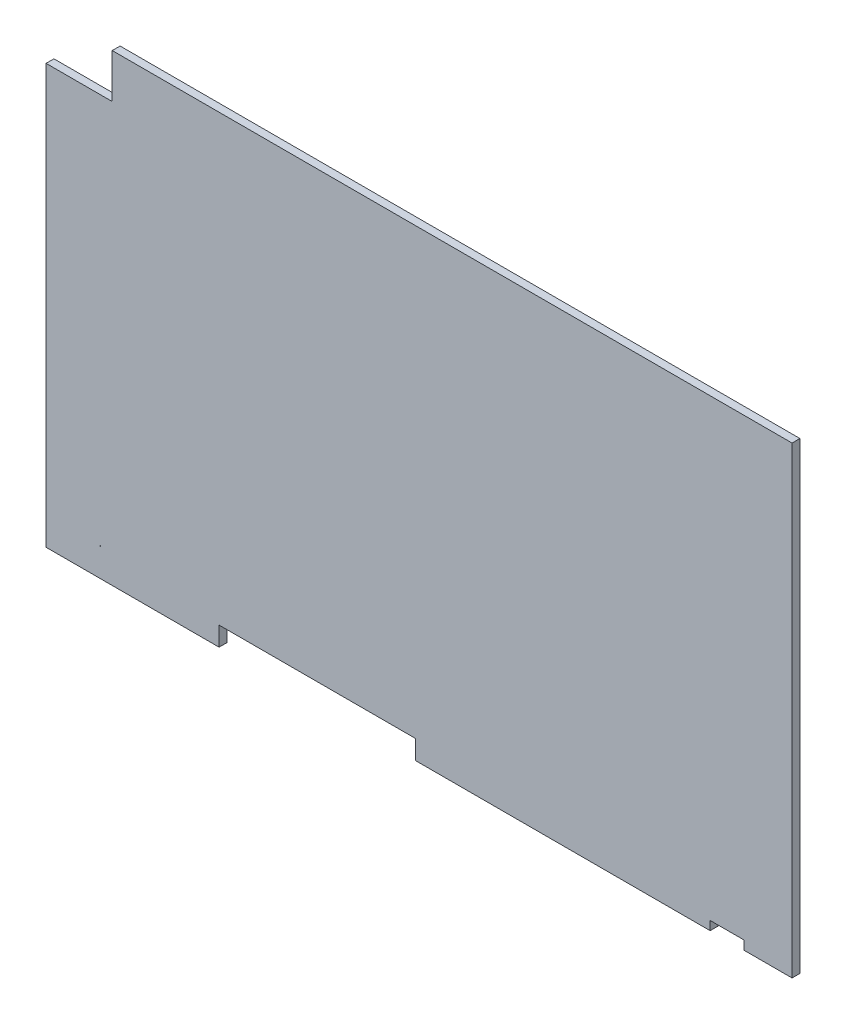
ISO-10303-21;
HEADER;
FILE_DESCRIPTION(('STEP AP214'),'2;1');
FILE_NAME('part.step','',(''),(''),'','','');
FILE_SCHEMA(('AUTOMOTIVE_DESIGN { 1 0 10303 214 1 1 1 1 }'));
ENDSEC;
DATA;
#1=APPLICATION_CONTEXT('core data for automotive mechanical design processes');
#2=APPLICATION_PROTOCOL_DEFINITION('international standard','automotive_design',2000,#1);
#3=PRODUCT_CONTEXT('',#1,'mechanical');
#4=PRODUCT('Part','Part','',(#3));
#5=PRODUCT_RELATED_PRODUCT_CATEGORY('part','',(#4));
#6=PRODUCT_DEFINITION_FORMATION('','',#4);
#7=PRODUCT_DEFINITION_CONTEXT('part definition',#1,'design');
#8=PRODUCT_DEFINITION('design','',#6,#7);
#9=PRODUCT_DEFINITION_SHAPE('','',#8);
#10=(LENGTH_UNIT() NAMED_UNIT(*) SI_UNIT(.MILLI.,.METRE.));
#11=(NAMED_UNIT(*) PLANE_ANGLE_UNIT() SI_UNIT($,.RADIAN.));
#12=(NAMED_UNIT(*) SI_UNIT($,.STERADIAN.) SOLID_ANGLE_UNIT());
#13=UNCERTAINTY_MEASURE_WITH_UNIT(LENGTH_MEASURE(1.E-05),#10,'distance_accuracy_value','');
#14=(GEOMETRIC_REPRESENTATION_CONTEXT(3) GLOBAL_UNCERTAINTY_ASSIGNED_CONTEXT((#13)) GLOBAL_UNIT_ASSIGNED_CONTEXT((#10,
#11,#12)) REPRESENTATION_CONTEXT('',''));
#15=CARTESIAN_POINT('',(0.,0.,0.));
#16=DIRECTION('',(0.,0.,1.));
#17=DIRECTION('',(1.,0.,0.));
#18=AXIS2_PLACEMENT_3D('',#15,#16,#17);
#19=CARTESIAN_POINT('',(-288.3708683859,210.3723583045,-1.7600024));
#20=DIRECTION('',(0.,0.,1.));
#21=DIRECTION('',(1.,0.,0.));
#22=AXIS2_PLACEMENT_3D('',#19,#20,#21);
#23=CYLINDRICAL_SURFACE('',#22,0.06249923999972);
#24=CARTESIAN_POINT('',(-288.3708683859,210.3723583045,0.));
#25=DIRECTION('',(0.,0.,-1.));
#26=DIRECTION('',(-1.,0.,0.));
#27=AXIS2_PLACEMENT_3D('',#24,#25,#26);
#28=CIRCLE('',#27,0.06249923999972);
#29=CARTESIAN_POINT('',(-288.4333676259,210.3723583045,0.));
#30=VERTEX_POINT('',#29);
#31=CARTESIAN_POINT('',(-288.3083691459,210.3723583045,0.));
#32=VERTEX_POINT('',#31);
#33=EDGE_CURVE('E249',#30,#32,#28,.T.);
#34=ORIENTED_EDGE('',*,*,#33,.F.);
#35=DIRECTION('',(0.,0.,-1.));
#36=VECTOR('',#35,1.);
#37=CARTESIAN_POINT('',(-288.4333676259,210.3723583045,0.));
#38=LINE('',#37,#36);
#39=CARTESIAN_POINT('',(-288.4333676259,210.3723583045,-1.6));
#40=VERTEX_POINT('',#39);
#41=EDGE_CURVE('E11',#30,#40,#38,.T.);
#42=ORIENTED_EDGE('',*,*,#41,.T.);
#43=CARTESIAN_POINT('',(-288.3708683859,210.3723583045,-1.6));
#44=DIRECTION('',(0.,0.,1.));
#45=DIRECTION('',(1.,0.,0.));
#46=AXIS2_PLACEMENT_3D('',#43,#44,#45);
#47=CIRCLE('',#46,0.06249923999972);
#48=CARTESIAN_POINT('',(-288.3083691459,210.3723583045,-1.6));
#49=VERTEX_POINT('',#48);
#50=EDGE_CURVE('E177',#49,#40,#47,.T.);
#51=ORIENTED_EDGE('',*,*,#50,.F.);
#52=DIRECTION('',(0.,0.,-1.));
#53=VECTOR('',#52,1.);
#54=CARTESIAN_POINT('',(-288.3083691459,210.3723583045,0.));
#55=LINE('',#54,#53);
#56=EDGE_CURVE('E26',#32,#49,#55,.T.);
#57=ORIENTED_EDGE('',*,*,#56,.F.);
#58=EDGE_LOOP('',(#34,#42,#51,#57));
#59=FACE_BOUND('',#58,.T.);
#60=ADVANCED_FACE('F17',(#59),#23,.F.);
#61=CARTESIAN_POINT('',(-288.3708683859,210.3723583045,-1.7600024));
#62=DIRECTION('',(0.,0.,1.));
#63=DIRECTION('',(1.,0.,0.));
#64=AXIS2_PLACEMENT_3D('',#61,#62,#63);
#65=CYLINDRICAL_SURFACE('',#64,0.06249923999972);
#66=ORIENTED_EDGE('',*,*,#56,.T.);
#67=CARTESIAN_POINT('',(-288.3708683859,210.3723583045,-1.6));
#68=DIRECTION('',(0.,0.,1.));
#69=DIRECTION('',(-1.,0.,0.));
#70=AXIS2_PLACEMENT_3D('',#67,#68,#69);
#71=CIRCLE('',#70,0.06249923999972);
#72=EDGE_CURVE('E181',#40,#49,#71,.T.);
#73=ORIENTED_EDGE('',*,*,#72,.F.);
#74=ORIENTED_EDGE('',*,*,#41,.F.);
#75=CARTESIAN_POINT('',(-288.3708683859,210.3723583045,0.));
#76=DIRECTION('',(0.,0.,-1.));
#77=DIRECTION('',(1.,0.,0.));
#78=AXIS2_PLACEMENT_3D('',#75,#76,#77);
#79=CIRCLE('',#78,0.06249923999972);
#80=EDGE_CURVE('E244',#32,#30,#79,.T.);
#81=ORIENTED_EDGE('',*,*,#80,.F.);
#82=EDGE_LOOP('',(#66,#73,#74,#81));
#83=FACE_BOUND('',#82,.T.);
#84=ADVANCED_FACE('F19',(#83),#65,.F.);
#85=CARTESIAN_POINT('',(-285.933831,208.874579,21.27488936264));
#86=DIRECTION('',(-1.,0.,0.));
#87=DIRECTION('',(0.,0.,1.));
#88=AXIS2_PLACEMENT_3D('',#85,#86,#87);
#89=PLANE('',#88);
#90=DIRECTION('',(0.,0.,1.));
#91=VECTOR('',#90,1.);
#92=CARTESIAN_POINT('',(-285.933831,290.0245785123,-1.6));
#93=LINE('',#92,#91);
#94=CARTESIAN_POINT('',(-285.933831,290.0245785123,-1.6));
#95=VERTEX_POINT('',#94);
#96=CARTESIAN_POINT('',(-285.933831,290.0245785123,0.));
#97=VERTEX_POINT('',#96);
#98=EDGE_CURVE('E261',#95,#97,#93,.T.);
#99=ORIENTED_EDGE('',*,*,#98,.T.);
#100=DIRECTION('',(0.,1.,0.));
#101=VECTOR('',#100,1.);
#102=CARTESIAN_POINT('',(-285.933831,290.0245785123,0.));
#103=LINE('',#102,#101);
#104=CARTESIAN_POINT('',(-285.933831,299.0245785123,0.));
#105=VERTEX_POINT('',#104);
#106=EDGE_CURVE('E221',#97,#105,#103,.T.);
#107=ORIENTED_EDGE('',*,*,#106,.T.);
#108=DIRECTION('',(0.,0.,-1.));
#109=VECTOR('',#108,1.);
#110=CARTESIAN_POINT('',(-285.933831,299.0245785123,0.));
#111=LINE('',#110,#109);
#112=CARTESIAN_POINT('',(-285.933831,299.0245785123,-1.6));
#113=VERTEX_POINT('',#112);
#114=EDGE_CURVE('E206',#105,#113,#111,.T.);
#115=ORIENTED_EDGE('',*,*,#114,.T.);
#116=DIRECTION('',(0.,1.,0.));
#117=VECTOR('',#116,1.);
#118=CARTESIAN_POINT('',(-285.933831,290.0245785123,-1.6));
#119=LINE('',#118,#117);
#120=EDGE_CURVE('E267',#95,#113,#119,.T.);
#121=ORIENTED_EDGE('',*,*,#120,.F.);
#122=EDGE_LOOP('',(#99,#107,#115,#121));
#123=FACE_BOUND('',#122,.T.);
#124=ADVANCED_FACE('F356',(#123),#89,.T.);
#125=CARTESIAN_POINT('',(-177.1665265142,299.0245785123,0.));
#126=DIRECTION('',(0.,1.,0.));
#127=DIRECTION('',(1.,0.,0.));
#128=AXIS2_PLACEMENT_3D('',#125,#126,#127);
#129=PLANE('',#128);
#130=DIRECTION('',(1.,0.,0.));
#131=VECTOR('',#130,1.);
#132=CARTESIAN_POINT('',(-285.933831,299.0245785123,0.));
#133=LINE('',#132,#131);
#134=CARTESIAN_POINT('',(-147.4165265142,299.0245785123,0.));
#135=VERTEX_POINT('',#134);
#136=EDGE_CURVE('E313',#105,#135,#133,.T.);
#137=ORIENTED_EDGE('',*,*,#136,.T.);
#138=DIRECTION('',(0.,0.,1.));
#139=VECTOR('',#138,1.);
#140=CARTESIAN_POINT('',(-147.4165265142,299.0245785123,-1.6));
#141=LINE('',#140,#139);
#142=CARTESIAN_POINT('',(-147.4165265142,299.0245785123,-1.6));
#143=VERTEX_POINT('',#142);
#144=EDGE_CURVE('E204',#143,#135,#141,.T.);
#145=ORIENTED_EDGE('',*,*,#144,.F.);
#146=DIRECTION('',(1.,0.,0.));
#147=VECTOR('',#146,1.);
#148=CARTESIAN_POINT('',(-285.933831,299.0245785123,-1.6));
#149=LINE('',#148,#147);
#150=EDGE_CURVE('E270',#113,#143,#149,.T.);
#151=ORIENTED_EDGE('',*,*,#150,.F.);
#152=ORIENTED_EDGE('',*,*,#114,.F.);
#153=EDGE_LOOP('',(#137,#145,#151,#152));
#154=FACE_BOUND('',#153,.T.);
#155=ADVANCED_FACE('F609',(#154),#129,.T.);
#156=CARTESIAN_POINT('',(-147.4165265142,204.6245785127,0.));
#157=DIRECTION('',(1.,0.,0.));
#158=DIRECTION('',(0.,1.,0.));
#159=AXIS2_PLACEMENT_3D('',#156,#157,#158);
#160=PLANE('',#159);
#161=DIRECTION('',(0.,0.,-1.));
#162=VECTOR('',#161,1.);
#163=CARTESIAN_POINT('',(-147.4165265142,204.6245785127,0.));
#164=LINE('',#163,#162);
#165=CARTESIAN_POINT('',(-147.4165265142,204.6245785127,0.));
#166=VERTEX_POINT('',#165);
#167=CARTESIAN_POINT('',(-147.4165265142,204.6245785127,-1.6));
#168=VERTEX_POINT('',#167);
#169=EDGE_CURVE('E201',#166,#168,#164,.T.);
#170=ORIENTED_EDGE('',*,*,#169,.T.);
#171=DIRECTION('',(0.,-1.,0.));
#172=VECTOR('',#171,1.);
#173=CARTESIAN_POINT('',(-147.4165265142,299.0245785123,-1.6));
#174=LINE('',#173,#172);
#175=EDGE_CURVE('E274',#143,#168,#174,.T.);
#176=ORIENTED_EDGE('',*,*,#175,.F.);
#177=ORIENTED_EDGE('',*,*,#144,.T.);
#178=DIRECTION('',(0.,-1.,0.));
#179=VECTOR('',#178,1.);
#180=CARTESIAN_POINT('',(-147.4165265142,299.0245785123,0.));
#181=LINE('',#180,#179);
#182=EDGE_CURVE('E240',#135,#166,#181,.T.);
#183=ORIENTED_EDGE('',*,*,#182,.T.);
#184=EDGE_LOOP('',(#170,#176,#177,#183));
#185=FACE_BOUND('',#184,.T.);
#186=ADVANCED_FACE('F597',(#185),#160,.T.);
#187=CARTESIAN_POINT('',(-320.4165265137,204.6245785127,0.));
#188=DIRECTION('',(0.,-1.,0.));
#189=DIRECTION('',(0.,0.,-1.));
#190=AXIS2_PLACEMENT_3D('',#187,#188,#189);
#191=PLANE('',#190);
#192=ORIENTED_EDGE('',*,*,#169,.F.);
#193=DIRECTION('',(-1.,0.,0.));
#194=VECTOR('',#193,1.);
#195=CARTESIAN_POINT('',(-147.4165265142,204.6245785127,0.));
#196=LINE('',#195,#194);
#197=CARTESIAN_POINT('',(-157.2215265136,204.6245785127,0.));
#198=VERTEX_POINT('',#197);
#199=EDGE_CURVE('E226',#166,#198,#196,.T.);
#200=ORIENTED_EDGE('',*,*,#199,.T.);
#201=DIRECTION('',(0.,0.,-1.));
#202=VECTOR('',#201,1.);
#203=CARTESIAN_POINT('',(-157.2215265136,204.6245785127,0.));
#204=LINE('',#203,#202);
#205=CARTESIAN_POINT('',(-157.2215265136,204.6245785127,-1.6));
#206=VERTEX_POINT('',#205);
#207=EDGE_CURVE('E198',#198,#206,#204,.T.);
#208=ORIENTED_EDGE('',*,*,#207,.T.);
#209=DIRECTION('',(-1.,0.,0.));
#210=VECTOR('',#209,1.);
#211=CARTESIAN_POINT('',(-147.4165265142,204.6245785127,-1.6));
#212=LINE('',#211,#210);
#213=EDGE_CURVE('E278',#168,#206,#212,.T.);
#214=ORIENTED_EDGE('',*,*,#213,.F.);
#215=EDGE_LOOP('',(#192,#200,#208,#214));
#216=FACE_BOUND('',#215,.T.);
#217=ADVANCED_FACE('F600',(#216),#191,.T.);
#218=CARTESIAN_POINT('',(-157.2215265136,205.9345785127,-1.7600024));
#219=DIRECTION('',(1.,0.,0.));
#220=DIRECTION('',(0.,1.,0.));
#221=AXIS2_PLACEMENT_3D('',#218,#219,#220);
#222=PLANE('',#221);
#223=DIRECTION('',(0.,-1.,0.));
#224=VECTOR('',#223,1.);
#225=CARTESIAN_POINT('',(-157.2215265136,206.4345785127,0.));
#226=LINE('',#225,#224);
#227=CARTESIAN_POINT('',(-157.2215265136,206.4345785127,0.));
#228=VERTEX_POINT('',#227);
#229=EDGE_CURVE('E223',#228,#198,#226,.T.);
#230=ORIENTED_EDGE('',*,*,#229,.F.);
#231=DIRECTION('',(0.,0.,-1.));
#232=VECTOR('',#231,1.);
#233=CARTESIAN_POINT('',(-157.2215265136,206.4345785127,0.));
#234=LINE('',#233,#232);
#235=CARTESIAN_POINT('',(-157.2215265136,206.4345785127,-1.6));
#236=VERTEX_POINT('',#235);
#237=EDGE_CURVE('E195',#228,#236,#234,.T.);
#238=ORIENTED_EDGE('',*,*,#237,.T.);
#239=DIRECTION('',(0.,-1.,0.));
#240=VECTOR('',#239,1.);
#241=CARTESIAN_POINT('',(-157.2215265136,206.4345785127,-1.6));
#242=LINE('',#241,#240);
#243=EDGE_CURVE('E282',#236,#206,#242,.T.);
#244=ORIENTED_EDGE('',*,*,#243,.T.);
#245=ORIENTED_EDGE('',*,*,#207,.F.);
#246=EDGE_LOOP('',(#230,#238,#244,#245));
#247=FACE_BOUND('',#246,.T.);
#248=ADVANCED_FACE('F296',(#247),#222,.F.);
#249=CARTESIAN_POINT('',(-164.1115265136,206.4345785127,-1.7600024));
#250=DIRECTION('',(0.,1.,0.));
#251=DIRECTION('',(1.,0.,0.));
#252=AXIS2_PLACEMENT_3D('',#249,#250,#251);
#253=PLANE('',#252);
#254=DIRECTION('',(0.,0.,1.));
#255=VECTOR('',#254,1.);
#256=CARTESIAN_POINT('',(-164.1115265136,206.4345785127,-1.6));
#257=LINE('',#256,#255);
#258=CARTESIAN_POINT('',(-164.1115265136,206.4345785127,-1.6));
#259=VERTEX_POINT('',#258);
#260=CARTESIAN_POINT('',(-164.1115265136,206.4345785127,0.));
#261=VERTEX_POINT('',#260);
#262=EDGE_CURVE('E192',#259,#261,#257,.T.);
#263=ORIENTED_EDGE('',*,*,#262,.F.);
#264=DIRECTION('',(1.,0.,0.));
#265=VECTOR('',#264,1.);
#266=CARTESIAN_POINT('',(-164.1115265136,206.4345785127,-1.6));
#267=LINE('',#266,#265);
#268=EDGE_CURVE('E164',#259,#236,#267,.T.);
#269=ORIENTED_EDGE('',*,*,#268,.T.);
#270=ORIENTED_EDGE('',*,*,#237,.F.);
#271=DIRECTION('',(1.,0.,0.));
#272=VECTOR('',#271,1.);
#273=CARTESIAN_POINT('',(-164.1115265136,206.4345785127,0.));
#274=LINE('',#273,#272);
#275=EDGE_CURVE('E227',#261,#228,#274,.T.);
#276=ORIENTED_EDGE('',*,*,#275,.F.);
#277=EDGE_LOOP('',(#263,#269,#270,#276));
#278=FACE_BOUND('',#277,.T.);
#279=ADVANCED_FACE('F291',(#278),#253,.F.);
#280=CARTESIAN_POINT('',(-164.1115265136,200.57397023,-1.7600024));
#281=DIRECTION('',(-1.,0.,0.));
#282=DIRECTION('',(0.,0.,1.));
#283=AXIS2_PLACEMENT_3D('',#280,#281,#282);
#284=PLANE('',#283);
#285=DIRECTION('',(0.,0.,1.));
#286=VECTOR('',#285,1.);
#287=CARTESIAN_POINT('',(-164.1115265136,204.6245785127,-1.6));
#288=LINE('',#287,#286);
#289=CARTESIAN_POINT('',(-164.1115265136,204.6245785127,-1.6));
#290=VERTEX_POINT('',#289);
#291=CARTESIAN_POINT('',(-164.1115265136,204.6245785127,0.));
#292=VERTEX_POINT('',#291);
#293=EDGE_CURVE('E141',#290,#292,#288,.T.);
#294=ORIENTED_EDGE('',*,*,#293,.F.);
#295=DIRECTION('',(0.,1.,0.));
#296=VECTOR('',#295,1.);
#297=CARTESIAN_POINT('',(-164.1115265136,204.6245785127,-1.6));
#298=LINE('',#297,#296);
#299=EDGE_CURVE('E157',#290,#259,#298,.T.);
#300=ORIENTED_EDGE('',*,*,#299,.T.);
#301=ORIENTED_EDGE('',*,*,#262,.T.);
#302=DIRECTION('',(0.,1.,0.));
#303=VECTOR('',#302,1.);
#304=CARTESIAN_POINT('',(-164.1115265136,204.6245785127,0.));
#305=LINE('',#304,#303);
#306=EDGE_CURVE('E243',#292,#261,#305,.T.);
#307=ORIENTED_EDGE('',*,*,#306,.F.);
#308=EDGE_LOOP('',(#294,#300,#301,#307));
#309=FACE_BOUND('',#308,.T.);
#310=ADVANCED_FACE('F634',(#309),#284,.F.);
#311=CARTESIAN_POINT('',(-320.4165265137,204.6245785127,0.));
#312=DIRECTION('',(0.,-1.,0.));
#313=DIRECTION('',(0.,0.,-1.));
#314=AXIS2_PLACEMENT_3D('',#311,#312,#313);
#315=PLANE('',#314);
#316=DIRECTION('',(-1.,0.,0.));
#317=VECTOR('',#316,1.);
#318=CARTESIAN_POINT('',(-164.1115265136,204.6245785127,0.));
#319=LINE('',#318,#317);
#320=CARTESIAN_POINT('',(-224.1665256919,204.6245785127,0.));
#321=VERTEX_POINT('',#320);
#322=EDGE_CURVE('E136',#292,#321,#319,.T.);
#323=ORIENTED_EDGE('',*,*,#322,.T.);
#324=DIRECTION('',(0.,0.,-1.));
#325=VECTOR('',#324,1.);
#326=CARTESIAN_POINT('',(-224.1665256919,204.6245785127,0.));
#327=LINE('',#326,#325);
#328=CARTESIAN_POINT('',(-224.1665256919,204.6245785127,-1.6));
#329=VERTEX_POINT('',#328);
#330=EDGE_CURVE('E129',#321,#329,#327,.T.);
#331=ORIENTED_EDGE('',*,*,#330,.T.);
#332=DIRECTION('',(-1.,0.,0.));
#333=VECTOR('',#332,1.);
#334=CARTESIAN_POINT('',(-164.1115265136,204.6245785127,-1.6));
#335=LINE('',#334,#333);
#336=EDGE_CURVE('E133',#290,#329,#335,.T.);
#337=ORIENTED_EDGE('',*,*,#336,.F.);
#338=ORIENTED_EDGE('',*,*,#293,.T.);
#339=EDGE_LOOP('',(#323,#331,#337,#338));
#340=FACE_BOUND('',#339,.T.);
#341=ADVANCED_FACE('F131',(#340),#315,.T.);
#342=CARTESIAN_POINT('',(-224.1665256919,208.7745785446,-1.7600024));
#343=DIRECTION('',(1.,0.,0.));
#344=DIRECTION('',(0.,1.,0.));
#345=AXIS2_PLACEMENT_3D('',#342,#343,#344);
#346=PLANE('',#345);
#347=DIRECTION('',(0.,-1.,0.));
#348=VECTOR('',#347,1.);
#349=CARTESIAN_POINT('',(-224.1665256919,208.5245785446,0.));
#350=LINE('',#349,#348);
#351=CARTESIAN_POINT('',(-224.1665256919,208.5245785446,0.));
#352=VERTEX_POINT('',#351);
#353=EDGE_CURVE('E228',#352,#321,#350,.T.);
#354=ORIENTED_EDGE('',*,*,#353,.F.);
#355=DIRECTION('',(0.,0.,-1.));
#356=VECTOR('',#355,1.);
#357=CARTESIAN_POINT('',(-224.1665256919,208.5245785446,0.));
#358=LINE('',#357,#356);
#359=CARTESIAN_POINT('',(-224.1665256919,208.5245785446,-1.6));
#360=VERTEX_POINT('',#359);
#361=EDGE_CURVE('E142',#352,#360,#358,.T.);
#362=ORIENTED_EDGE('',*,*,#361,.T.);
#363=DIRECTION('',(0.,-1.,0.));
#364=VECTOR('',#363,1.);
#365=CARTESIAN_POINT('',(-224.1665256919,208.5245785446,-1.6));
#366=LINE('',#365,#364);
#367=EDGE_CURVE('E145',#360,#329,#366,.T.);
#368=ORIENTED_EDGE('',*,*,#367,.T.);
#369=ORIENTED_EDGE('',*,*,#330,.F.);
#370=EDGE_LOOP('',(#354,#362,#368,#369));
#371=FACE_BOUND('',#370,.T.);
#372=ADVANCED_FACE('F146',(#371),#346,.F.);
#373=CARTESIAN_POINT('',(-260.5915257238,208.5245785446,-1.7600024));
#374=DIRECTION('',(0.,1.,0.));
#375=DIRECTION('',(1.,0.,0.));
#376=AXIS2_PLACEMENT_3D('',#373,#374,#375);
#377=PLANE('',#376);
#378=DIRECTION('',(0.,0.,1.));
#379=VECTOR('',#378,1.);
#380=CARTESIAN_POINT('',(-264.1665257238,208.5245785446,-1.6));
#381=LINE('',#380,#379);
#382=CARTESIAN_POINT('',(-264.1665257238,208.5245785446,-1.6));
#383=VERTEX_POINT('',#382);
#384=CARTESIAN_POINT('',(-264.1665257238,208.5245785446,0.));
#385=VERTEX_POINT('',#384);
#386=EDGE_CURVE('E187',#383,#385,#381,.T.);
#387=ORIENTED_EDGE('',*,*,#386,.F.);
#388=DIRECTION('',(1.,0.,0.));
#389=VECTOR('',#388,1.);
#390=CARTESIAN_POINT('',(-264.1665257238,208.5245785446,-1.6));
#391=LINE('',#390,#389);
#392=EDGE_CURVE('E151',#383,#360,#391,.T.);
#393=ORIENTED_EDGE('',*,*,#392,.T.);
#394=ORIENTED_EDGE('',*,*,#361,.F.);
#395=DIRECTION('',(1.,0.,0.));
#396=VECTOR('',#395,1.);
#397=CARTESIAN_POINT('',(-264.1665257238,208.5245785446,0.));
#398=LINE('',#397,#396);
#399=EDGE_CURVE('E231',#385,#352,#398,.T.);
#400=ORIENTED_EDGE('',*,*,#399,.F.);
#401=EDGE_LOOP('',(#387,#393,#394,#400));
#402=FACE_BOUND('',#401,.T.);
#403=ADVANCED_FACE('F341',(#402),#377,.F.);
#404=CARTESIAN_POINT('',(-264.1665257238,199.3393347496,-1.7600024));
#405=DIRECTION('',(-1.,0.,0.));
#406=DIRECTION('',(0.,0.,1.));
#407=AXIS2_PLACEMENT_3D('',#404,#405,#406);
#408=PLANE('',#407);
#409=DIRECTION('',(0.,1.,0.));
#410=VECTOR('',#409,1.);
#411=CARTESIAN_POINT('',(-264.1665257238,204.6245785127,-1.6));
#412=LINE('',#411,#410);
#413=CARTESIAN_POINT('',(-264.1665257238,204.6245785127,-1.6));
#414=VERTEX_POINT('',#413);
#415=EDGE_CURVE('E170',#414,#383,#412,.T.);
#416=ORIENTED_EDGE('',*,*,#415,.T.);
#417=ORIENTED_EDGE('',*,*,#386,.T.);
#418=DIRECTION('',(0.,1.,0.));
#419=VECTOR('',#418,1.);
#420=CARTESIAN_POINT('',(-264.1665257238,204.6245785127,0.));
#421=LINE('',#420,#419);
#422=CARTESIAN_POINT('',(-264.1665257238,204.6245785127,0.));
#423=VERTEX_POINT('',#422);
#424=EDGE_CURVE('E316',#423,#385,#421,.T.);
#425=ORIENTED_EDGE('',*,*,#424,.F.);
#426=DIRECTION('',(0.,0.,1.));
#427=VECTOR('',#426,1.);
#428=CARTESIAN_POINT('',(-264.1665257238,204.6245785127,-1.6));
#429=LINE('',#428,#427);
#430=EDGE_CURVE('E184',#414,#423,#429,.T.);
#431=ORIENTED_EDGE('',*,*,#430,.F.);
#432=EDGE_LOOP('',(#416,#417,#425,#431));
#433=FACE_BOUND('',#432,.T.);
#434=ADVANCED_FACE('F338',(#433),#408,.F.);
#435=CARTESIAN_POINT('',(-290.4165265137,204.6245785127,0.));
#436=DIRECTION('',(0.,-1.,0.));
#437=DIRECTION('',(0.,0.,-1.));
#438=AXIS2_PLACEMENT_3D('',#435,#436,#437);
#439=PLANE('',#438);
#440=DIRECTION('',(-1.,0.,0.));
#441=VECTOR('',#440,1.);
#442=CARTESIAN_POINT('',(-264.1665257238,204.6245785127,0.));
#443=LINE('',#442,#441);
#444=CARTESIAN_POINT('',(-299.4165265136,204.6245785127,0.));
#445=VERTEX_POINT('',#444);
#446=EDGE_CURVE('E322',#423,#445,#443,.T.);
#447=ORIENTED_EDGE('',*,*,#446,.T.);
#448=DIRECTION('',(0.,0.,-1.));
#449=VECTOR('',#448,1.);
#450=CARTESIAN_POINT('',(-299.4165265136,204.6245785127,0.));
#451=LINE('',#450,#449);
#452=CARTESIAN_POINT('',(-299.4165265136,204.6245785127,-1.6));
#453=VERTEX_POINT('',#452);
#454=EDGE_CURVE('E253',#445,#453,#451,.T.);
#455=ORIENTED_EDGE('',*,*,#454,.T.);
#456=DIRECTION('',(-1.,0.,0.));
#457=VECTOR('',#456,1.);
#458=CARTESIAN_POINT('',(-264.1665257238,204.6245785127,-1.6));
#459=LINE('',#458,#457);
#460=EDGE_CURVE('E174',#414,#453,#459,.T.);
#461=ORIENTED_EDGE('',*,*,#460,.F.);
#462=ORIENTED_EDGE('',*,*,#430,.T.);
#463=EDGE_LOOP('',(#447,#455,#461,#462));
#464=FACE_BOUND('',#463,.T.);
#465=ADVANCED_FACE('F346',(#464),#439,.T.);
#466=CARTESIAN_POINT('',(0.,0.,-1.6));
#467=DIRECTION('',(0.,0.,1.));
#468=DIRECTION('',(1.,0.,0.));
#469=AXIS2_PLACEMENT_3D('',#466,#467,#468);
#470=PLANE('',#469);
#471=ORIENTED_EDGE('',*,*,#50,.T.);
#472=ORIENTED_EDGE('',*,*,#72,.T.);
#473=EDGE_LOOP('',(#471,#472));
#474=FACE_BOUND('',#473,.T.);
#475=ORIENTED_EDGE('',*,*,#120,.T.);
#476=ORIENTED_EDGE('',*,*,#150,.T.);
#477=ORIENTED_EDGE('',*,*,#175,.T.);
#478=ORIENTED_EDGE('',*,*,#213,.T.);
#479=ORIENTED_EDGE('',*,*,#243,.F.);
#480=ORIENTED_EDGE('',*,*,#268,.F.);
#481=ORIENTED_EDGE('',*,*,#299,.F.);
#482=ORIENTED_EDGE('',*,*,#336,.T.);
#483=ORIENTED_EDGE('',*,*,#367,.F.);
#484=ORIENTED_EDGE('',*,*,#392,.F.);
#485=ORIENTED_EDGE('',*,*,#415,.F.);
#486=ORIENTED_EDGE('',*,*,#460,.T.);
#487=DIRECTION('',(0.,1.,0.));
#488=VECTOR('',#487,1.);
#489=CARTESIAN_POINT('',(-299.4165265136,204.6245785127,-1.6));
#490=LINE('',#489,#488);
#491=CARTESIAN_POINT('',(-299.4165265136,290.0245785123,-1.6));
#492=VERTEX_POINT('',#491);
#493=EDGE_CURVE('E248',#453,#492,#490,.T.);
#494=ORIENTED_EDGE('',*,*,#493,.T.);
#495=DIRECTION('',(-1.,0.,0.));
#496=VECTOR('',#495,1.);
#497=CARTESIAN_POINT('',(-285.933831,290.0245785123,-1.6));
#498=LINE('',#497,#496);
#499=EDGE_CURVE('E264',#95,#492,#498,.T.);
#500=ORIENTED_EDGE('',*,*,#499,.F.);
#501=EDGE_LOOP('',(#475,#476,#477,#478,#479,#480,#481,#482,#483,#484,#485,#486,#494,#500));
#502=FACE_BOUND('',#501,.T.);
#503=ADVANCED_FACE('F154',(#474,#502),#470,.F.);
#504=CARTESIAN_POINT('',(-291.4165265136,290.0245785123,-1.7600024));
#505=DIRECTION('',(0.,-1.,0.));
#506=DIRECTION('',(0.,0.,-1.));
#507=AXIS2_PLACEMENT_3D('',#504,#505,#506);
#508=PLANE('',#507);
#509=DIRECTION('',(-1.,0.,0.));
#510=VECTOR('',#509,1.);
#511=CARTESIAN_POINT('',(-285.933831,290.0245785123,0.));
#512=LINE('',#511,#510);
#513=CARTESIAN_POINT('',(-299.4165265136,290.0245785123,0.));
#514=VERTEX_POINT('',#513);
#515=EDGE_CURVE('E232',#97,#514,#512,.T.);
#516=ORIENTED_EDGE('',*,*,#515,.F.);
#517=ORIENTED_EDGE('',*,*,#98,.F.);
#518=ORIENTED_EDGE('',*,*,#499,.T.);
#519=DIRECTION('',(0.,0.,-1.));
#520=VECTOR('',#519,1.);
#521=CARTESIAN_POINT('',(-299.4165265136,290.0245785123,0.));
#522=LINE('',#521,#520);
#523=EDGE_CURVE('E257',#514,#492,#522,.T.);
#524=ORIENTED_EDGE('',*,*,#523,.F.);
#525=EDGE_LOOP('',(#516,#517,#518,#524));
#526=FACE_BOUND('',#525,.T.);
#527=ADVANCED_FACE('F353',(#526),#508,.F.);
#528=CARTESIAN_POINT('',(-299.4165265136,299.3745785123,0.));
#529=DIRECTION('',(-1.,0.,0.));
#530=DIRECTION('',(0.,0.,1.));
#531=AXIS2_PLACEMENT_3D('',#528,#529,#530);
#532=PLANE('',#531);
#533=ORIENTED_EDGE('',*,*,#493,.F.);
#534=ORIENTED_EDGE('',*,*,#454,.F.);
#535=DIRECTION('',(0.,1.,0.));
#536=VECTOR('',#535,1.);
#537=CARTESIAN_POINT('',(-299.4165265136,204.6245785127,0.));
#538=LINE('',#537,#536);
#539=EDGE_CURVE('E236',#445,#514,#538,.T.);
#540=ORIENTED_EDGE('',*,*,#539,.T.);
#541=ORIENTED_EDGE('',*,*,#523,.T.);
#542=EDGE_LOOP('',(#533,#534,#540,#541));
#543=FACE_BOUND('',#542,.T.);
#544=ADVANCED_FACE('F350',(#543),#532,.T.);
#545=CARTESIAN_POINT('',(0.,0.,0.));
#546=DIRECTION('',(0.,0.,1.));
#547=DIRECTION('',(1.,0.,0.));
#548=AXIS2_PLACEMENT_3D('',#545,#546,#547);
#549=PLANE('',#548);
#550=ORIENTED_EDGE('',*,*,#33,.T.);
#551=ORIENTED_EDGE('',*,*,#80,.T.);
#552=EDGE_LOOP('',(#550,#551));
#553=FACE_BOUND('',#552,.T.);
#554=ORIENTED_EDGE('',*,*,#446,.F.);
#555=ORIENTED_EDGE('',*,*,#424,.T.);
#556=ORIENTED_EDGE('',*,*,#399,.T.);
#557=ORIENTED_EDGE('',*,*,#353,.T.);
#558=ORIENTED_EDGE('',*,*,#322,.F.);
#559=ORIENTED_EDGE('',*,*,#306,.T.);
#560=ORIENTED_EDGE('',*,*,#275,.T.);
#561=ORIENTED_EDGE('',*,*,#229,.T.);
#562=ORIENTED_EDGE('',*,*,#199,.F.);
#563=ORIENTED_EDGE('',*,*,#182,.F.);
#564=ORIENTED_EDGE('',*,*,#136,.F.);
#565=ORIENTED_EDGE('',*,*,#106,.F.);
#566=ORIENTED_EDGE('',*,*,#515,.T.);
#567=ORIENTED_EDGE('',*,*,#539,.F.);
#568=EDGE_LOOP('',(#554,#555,#556,#557,#558,#559,#560,#561,#562,#563,#564,#565,#566,#567));
#569=FACE_BOUND('',#568,.T.);
#570=ADVANCED_FACE('F302',(#553,#569),#549,.T.);
#571=CLOSED_SHELL('',(#60,#84,#124,#155,#186,#217,#248,#279,#310,#341,#372,#403,#434,#465,#503,
#527,#544,#570));
#572=MANIFOLD_SOLID_BREP('B1',#571);
#573=ADVANCED_BREP_SHAPE_REPRESENTATION('',(#18,#572),#14);
#574=SHAPE_DEFINITION_REPRESENTATION(#9,#573);
ENDSEC;
END-ISO-10303-21;
